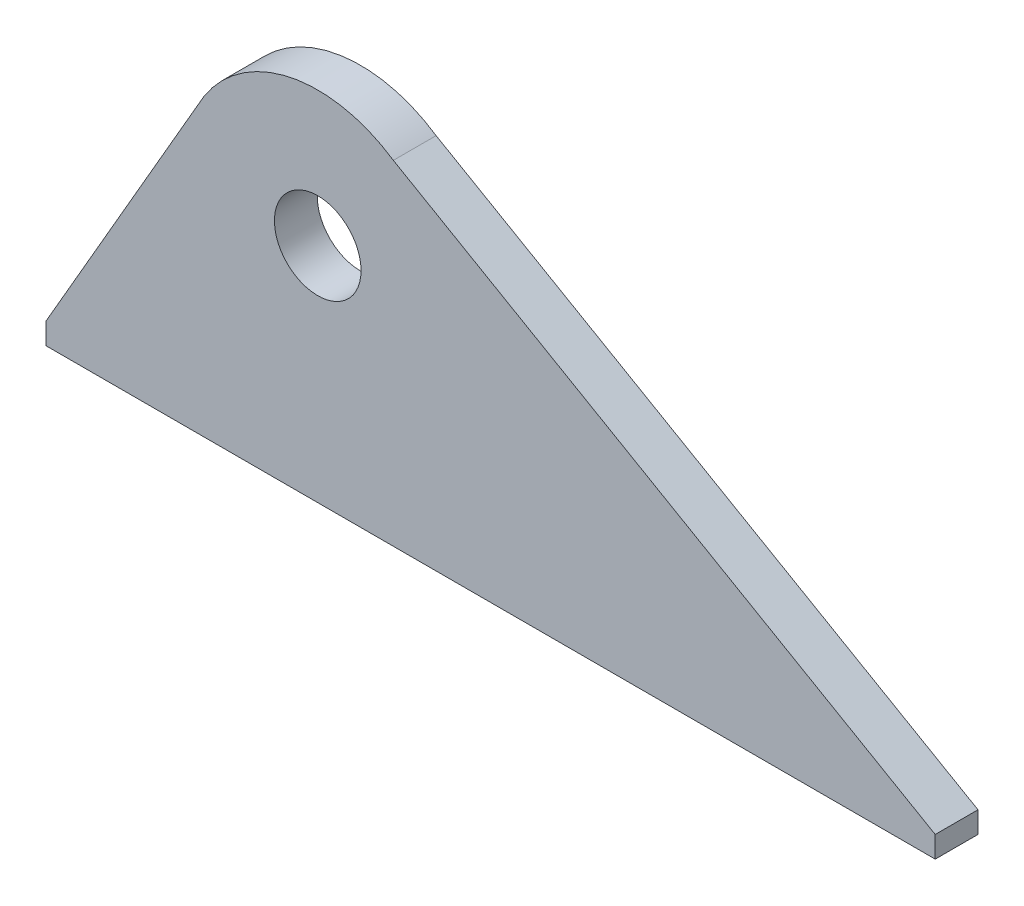
ISO-10303-21;
HEADER;
FILE_DESCRIPTION(('STEP AP214'),'2;1');
FILE_NAME('part.step','',(''),(''),'','','');
FILE_SCHEMA(('AUTOMOTIVE_DESIGN { 1 0 10303 214 1 1 1 1 }'));
ENDSEC;
DATA;
#1=APPLICATION_CONTEXT('core data for automotive mechanical design processes');
#2=APPLICATION_PROTOCOL_DEFINITION('international standard','automotive_design',2000,#1);
#3=PRODUCT_CONTEXT('',#1,'mechanical');
#4=PRODUCT('Part','Part','',(#3));
#5=PRODUCT_RELATED_PRODUCT_CATEGORY('part','',(#4));
#6=PRODUCT_DEFINITION_FORMATION('','',#4);
#7=PRODUCT_DEFINITION_CONTEXT('part definition',#1,'design');
#8=PRODUCT_DEFINITION('design','',#6,#7);
#9=PRODUCT_DEFINITION_SHAPE('','',#8);
#10=(LENGTH_UNIT() NAMED_UNIT(*) SI_UNIT(.MILLI.,.METRE.));
#11=(NAMED_UNIT(*) PLANE_ANGLE_UNIT() SI_UNIT($,.RADIAN.));
#12=(NAMED_UNIT(*) SI_UNIT($,.STERADIAN.) SOLID_ANGLE_UNIT());
#13=UNCERTAINTY_MEASURE_WITH_UNIT(LENGTH_MEASURE(1.E-05),#10,'distance_accuracy_value','');
#14=(GEOMETRIC_REPRESENTATION_CONTEXT(3) GLOBAL_UNCERTAINTY_ASSIGNED_CONTEXT((#13)) GLOBAL_UNIT_ASSIGNED_CONTEXT((#10,
#11,#12)) REPRESENTATION_CONTEXT('',''));
#15=CARTESIAN_POINT('',(0.,0.,0.));
#16=DIRECTION('',(0.,0.,1.));
#17=DIRECTION('',(1.,0.,0.));
#18=AXIS2_PLACEMENT_3D('',#15,#16,#17);
#19=CARTESIAN_POINT('',(63.5247751785543,52.0281381486472,10.));
#20=DIRECTION('',(0.,0.,-1.));
#21=DIRECTION('',(-1.,0.,0.));
#22=AXIS2_PLACEMENT_3D('',#19,#20,#21);
#23=PLANE('',#22);
#24=DIRECTION('',(0.,-1.,0.));
#25=VECTOR('',#24,1.);
#26=CARTESIAN_POINT('',(0.,5.,10.));
#27=LINE('',#26,#25);
#28=CARTESIAN_POINT('',(0.,5.,10.));
#29=VERTEX_POINT('',#28);
#30=CARTESIAN_POINT('',(0.,0.,10.));
#31=VERTEX_POINT('',#30);
#32=EDGE_CURVE('E129',#29,#31,#27,.T.);
#33=ORIENTED_EDGE('',*,*,#32,.T.);
#34=DIRECTION('',(1.,0.,0.));
#35=VECTOR('',#34,1.);
#36=CARTESIAN_POINT('',(0.,0.,10.));
#37=LINE('',#36,#35);
#38=CARTESIAN_POINT('',(207.878588043657,0.,10.));
#39=VERTEX_POINT('',#38);
#40=EDGE_CURVE('E87',#31,#39,#37,.T.);
#41=ORIENTED_EDGE('',*,*,#40,.T.);
#42=DIRECTION('',(0.,1.,0.));
#43=VECTOR('',#42,1.);
#44=CARTESIAN_POINT('',(207.878588043657,0.,10.));
#45=LINE('',#44,#43);
#46=CARTESIAN_POINT('',(207.878588043657,5.,10.));
#47=VERTEX_POINT('',#46);
#48=EDGE_CURVE('E100',#39,#47,#45,.T.);
#49=ORIENTED_EDGE('',*,*,#48,.T.);
#50=DIRECTION('',(-0.866025403784442,0.499999999999995,0.));
#51=VECTOR('',#50,1.);
#52=CARTESIAN_POINT('',(207.878588043657,5.,10.));
#53=LINE('',#52,#51);
#54=CARTESIAN_POINT('',(81.2013031704552,78.1371645217532,10.));
#55=VERTEX_POINT('',#54);
#56=EDGE_CURVE('E94',#47,#55,#53,.T.);
#57=ORIENTED_EDGE('',*,*,#56,.T.);
#58=CARTESIAN_POINT('',(63.5247751785543,52.0281381486472,10.));
#59=DIRECTION('',(0.,0.,1.));
#60=DIRECTION('',(-1.,0.,0.));
#61=AXIS2_PLACEMENT_3D('',#58,#59,#60);
#62=CIRCLE('',#61,31.53);
#63=CARTESIAN_POINT('',(36.9325249575264,68.9690096782423,10.));
#64=VERTEX_POINT('',#63);
#65=EDGE_CURVE('E98',#55,#64,#62,.T.);
#66=ORIENTED_EDGE('',*,*,#65,.T.);
#67=DIRECTION('',(-0.499999999999995,-0.866025403784442,0.));
#68=VECTOR('',#67,1.);
#69=CARTESIAN_POINT('',(36.9325249575264,68.9690096782423,10.));
#70=LINE('',#69,#68);
#71=EDGE_CURVE('E50',#64,#29,#70,.T.);
#72=ORIENTED_EDGE('',*,*,#71,.T.);
#73=EDGE_LOOP('',(#33,#41,#49,#57,#66,#72));
#74=FACE_BOUND('',#73,.T.);
#75=CARTESIAN_POINT('',(63.5247751785543,52.0281381486472,10.));
#76=DIRECTION('',(0.,0.,1.));
#77=DIRECTION('',(1.,0.,0.));
#78=AXIS2_PLACEMENT_3D('',#75,#76,#77);
#79=CIRCLE('',#78,10.1249999999998);
#80=CARTESIAN_POINT('',(73.6497751785541,52.0281381486472,10.));
#81=VERTEX_POINT('',#80);
#82=EDGE_CURVE('E122',#81,#81,#79,.T.);
#83=ORIENTED_EDGE('',*,*,#82,.F.);
#84=EDGE_LOOP('',(#83));
#85=FACE_BOUND('',#84,.T.);
#86=ADVANCED_FACE('F33',(#74,#85),#23,.F.);
#87=CARTESIAN_POINT('',(63.5247751785543,52.0281381486472,0.));
#88=DIRECTION('',(0.,0.,-1.));
#89=DIRECTION('',(-1.,0.,0.));
#90=AXIS2_PLACEMENT_3D('',#87,#88,#89);
#91=PLANE('',#90);
#92=DIRECTION('',(0.,-1.,0.));
#93=VECTOR('',#92,1.);
#94=CARTESIAN_POINT('',(0.,5.,0.));
#95=LINE('',#94,#93);
#96=CARTESIAN_POINT('',(0.,5.,0.));
#97=VERTEX_POINT('',#96);
#98=CARTESIAN_POINT('',(0.,0.,0.));
#99=VERTEX_POINT('',#98);
#100=EDGE_CURVE('E118',#97,#99,#95,.T.);
#101=ORIENTED_EDGE('',*,*,#100,.F.);
#102=DIRECTION('',(-0.499999999999995,-0.866025403784442,0.));
#103=VECTOR('',#102,1.);
#104=CARTESIAN_POINT('',(36.9325249575264,68.9690096782423,0.));
#105=LINE('',#104,#103);
#106=CARTESIAN_POINT('',(36.9325249575264,68.9690096782423,0.));
#107=VERTEX_POINT('',#106);
#108=EDGE_CURVE('E79',#107,#97,#105,.T.);
#109=ORIENTED_EDGE('',*,*,#108,.F.);
#110=CARTESIAN_POINT('',(63.5247751785543,52.0281381486472,0.));
#111=DIRECTION('',(0.,0.,1.));
#112=DIRECTION('',(-1.,0.,0.));
#113=AXIS2_PLACEMENT_3D('',#110,#111,#112);
#114=CIRCLE('',#113,31.53);
#115=CARTESIAN_POINT('',(81.2013031704552,78.1371645217532,0.));
#116=VERTEX_POINT('',#115);
#117=EDGE_CURVE('E73',#116,#107,#114,.T.);
#118=ORIENTED_EDGE('',*,*,#117,.F.);
#119=DIRECTION('',(-0.866025403784442,0.499999999999995,0.));
#120=VECTOR('',#119,1.);
#121=CARTESIAN_POINT('',(207.878588043657,5.,0.));
#122=LINE('',#121,#120);
#123=CARTESIAN_POINT('',(207.878588043657,5.,0.));
#124=VERTEX_POINT('',#123);
#125=EDGE_CURVE('E108',#124,#116,#122,.T.);
#126=ORIENTED_EDGE('',*,*,#125,.F.);
#127=DIRECTION('',(0.,1.,0.));
#128=VECTOR('',#127,1.);
#129=CARTESIAN_POINT('',(207.878588043657,0.,0.));
#130=LINE('',#129,#128);
#131=CARTESIAN_POINT('',(207.878588043657,0.,0.));
#132=VERTEX_POINT('',#131);
#133=EDGE_CURVE('E124',#132,#124,#130,.T.);
#134=ORIENTED_EDGE('',*,*,#133,.F.);
#135=DIRECTION('',(1.,0.,0.));
#136=VECTOR('',#135,1.);
#137=CARTESIAN_POINT('',(0.,0.,0.));
#138=LINE('',#137,#136);
#139=EDGE_CURVE('E121',#99,#132,#138,.T.);
#140=ORIENTED_EDGE('',*,*,#139,.F.);
#141=EDGE_LOOP('',(#101,#109,#118,#126,#134,#140));
#142=FACE_BOUND('',#141,.T.);
#143=CARTESIAN_POINT('',(63.5247751785543,52.0281381486472,0.));
#144=DIRECTION('',(0.,0.,1.));
#145=DIRECTION('',(1.,0.,0.));
#146=AXIS2_PLACEMENT_3D('',#143,#144,#145);
#147=CIRCLE('',#146,10.1249999999998);
#148=CARTESIAN_POINT('',(73.6497751785541,52.0281381486472,0.));
#149=VERTEX_POINT('',#148);
#150=EDGE_CURVE('E222',#149,#149,#147,.T.);
#151=ORIENTED_EDGE('',*,*,#150,.T.);
#152=EDGE_LOOP('',(#151));
#153=FACE_BOUND('',#152,.T.);
#154=ADVANCED_FACE('F138',(#142,#153),#91,.T.);
#155=CARTESIAN_POINT('',(0.,5.,10.));
#156=DIRECTION('',(1.,0.,0.));
#157=DIRECTION('',(0.,0.,-1.));
#158=AXIS2_PLACEMENT_3D('',#155,#156,#157);
#159=PLANE('',#158);
#160=ORIENTED_EDGE('',*,*,#100,.T.);
#161=DIRECTION('',(0.,0.,-1.));
#162=VECTOR('',#161,1.);
#163=CARTESIAN_POINT('',(0.,0.,10.));
#164=LINE('',#163,#162);
#165=EDGE_CURVE('E11',#31,#99,#164,.T.);
#166=ORIENTED_EDGE('',*,*,#165,.F.);
#167=ORIENTED_EDGE('',*,*,#32,.F.);
#168=DIRECTION('',(0.,0.,-1.));
#169=VECTOR('',#168,1.);
#170=CARTESIAN_POINT('',(0.,5.,10.));
#171=LINE('',#170,#169);
#172=EDGE_CURVE('E114',#29,#97,#171,.T.);
#173=ORIENTED_EDGE('',*,*,#172,.T.);
#174=EDGE_LOOP('',(#160,#166,#167,#173));
#175=FACE_BOUND('',#174,.T.);
#176=ADVANCED_FACE('F35',(#175),#159,.F.);
#177=CARTESIAN_POINT('',(0.,0.,10.));
#178=DIRECTION('',(0.,1.,0.));
#179=DIRECTION('',(0.,0.,1.));
#180=AXIS2_PLACEMENT_3D('',#177,#178,#179);
#181=PLANE('',#180);
#182=ORIENTED_EDGE('',*,*,#139,.T.);
#183=DIRECTION('',(0.,0.,-1.));
#184=VECTOR('',#183,1.);
#185=CARTESIAN_POINT('',(207.878588043657,0.,10.));
#186=LINE('',#185,#184);
#187=EDGE_CURVE('E42',#39,#132,#186,.T.);
#188=ORIENTED_EDGE('',*,*,#187,.F.);
#189=ORIENTED_EDGE('',*,*,#40,.F.);
#190=ORIENTED_EDGE('',*,*,#165,.T.);
#191=EDGE_LOOP('',(#182,#188,#189,#190));
#192=FACE_BOUND('',#191,.T.);
#193=ADVANCED_FACE('F163',(#192),#181,.F.);
#194=CARTESIAN_POINT('',(207.878588043657,0.,10.));
#195=DIRECTION('',(-1.,0.,0.));
#196=DIRECTION('',(0.,0.,1.));
#197=AXIS2_PLACEMENT_3D('',#194,#195,#196);
#198=PLANE('',#197);
#199=ORIENTED_EDGE('',*,*,#133,.T.);
#200=DIRECTION('',(0.,0.,-1.));
#201=VECTOR('',#200,1.);
#202=CARTESIAN_POINT('',(207.878588043657,5.,10.));
#203=LINE('',#202,#201);
#204=EDGE_CURVE('E109',#47,#124,#203,.T.);
#205=ORIENTED_EDGE('',*,*,#204,.F.);
#206=ORIENTED_EDGE('',*,*,#48,.F.);
#207=ORIENTED_EDGE('',*,*,#187,.T.);
#208=EDGE_LOOP('',(#199,#205,#206,#207));
#209=FACE_BOUND('',#208,.T.);
#210=ADVANCED_FACE('F135',(#209),#198,.F.);
#211=CARTESIAN_POINT('',(207.878588043657,5.,10.));
#212=DIRECTION('',(-0.499999999999995,-0.866025403784442,0.));
#213=DIRECTION('',(0.866025403784442,-0.499999999999995,0.));
#214=AXIS2_PLACEMENT_3D('',#211,#212,#213);
#215=PLANE('',#214);
#216=ORIENTED_EDGE('',*,*,#125,.T.);
#217=DIRECTION('',(0.,0.,-1.));
#218=VECTOR('',#217,1.);
#219=CARTESIAN_POINT('',(81.2013031704552,78.1371645217532,10.));
#220=LINE('',#219,#218);
#221=EDGE_CURVE('E105',#55,#116,#220,.T.);
#222=ORIENTED_EDGE('',*,*,#221,.F.);
#223=ORIENTED_EDGE('',*,*,#56,.F.);
#224=ORIENTED_EDGE('',*,*,#204,.T.);
#225=EDGE_LOOP('',(#216,#222,#223,#224));
#226=FACE_BOUND('',#225,.T.);
#227=ADVANCED_FACE('F106',(#226),#215,.F.);
#228=CARTESIAN_POINT('',(63.5247751785543,52.0281381486472,10.));
#229=DIRECTION('',(0.,0.,-1.));
#230=DIRECTION('',(-1.,0.,0.));
#231=AXIS2_PLACEMENT_3D('',#228,#229,#230);
#232=CYLINDRICAL_SURFACE('',#231,31.53);
#233=ORIENTED_EDGE('',*,*,#117,.T.);
#234=DIRECTION('',(0.,0.,-1.));
#235=VECTOR('',#234,1.);
#236=CARTESIAN_POINT('',(36.9325249575264,68.9690096782423,10.));
#237=LINE('',#236,#235);
#238=EDGE_CURVE('E110',#64,#107,#237,.T.);
#239=ORIENTED_EDGE('',*,*,#238,.F.);
#240=ORIENTED_EDGE('',*,*,#65,.F.);
#241=ORIENTED_EDGE('',*,*,#221,.T.);
#242=EDGE_LOOP('',(#233,#239,#240,#241));
#243=FACE_BOUND('',#242,.T.);
#244=ADVANCED_FACE('F112',(#243),#232,.T.);
#245=CARTESIAN_POINT('',(36.9325249575264,68.9690096782423,10.));
#246=DIRECTION('',(0.866025403784442,-0.499999999999995,0.));
#247=DIRECTION('',(0.499999999999995,0.866025403784442,0.));
#248=AXIS2_PLACEMENT_3D('',#245,#246,#247);
#249=PLANE('',#248);
#250=ORIENTED_EDGE('',*,*,#108,.T.);
#251=ORIENTED_EDGE('',*,*,#172,.F.);
#252=ORIENTED_EDGE('',*,*,#71,.F.);
#253=ORIENTED_EDGE('',*,*,#238,.T.);
#254=EDGE_LOOP('',(#250,#251,#252,#253));
#255=FACE_BOUND('',#254,.T.);
#256=ADVANCED_FACE('F143',(#255),#249,.F.);
#257=CARTESIAN_POINT('',(63.5247751785543,52.0281381486472,10.));
#258=DIRECTION('',(0.,0.,-1.));
#259=DIRECTION('',(-1.,0.,0.));
#260=AXIS2_PLACEMENT_3D('',#257,#258,#259);
#261=CYLINDRICAL_SURFACE('',#260,10.1249999999998);
#262=ORIENTED_EDGE('',*,*,#82,.T.);
#263=EDGE_LOOP('',(#262));
#264=FACE_BOUND('',#263,.T.);
#265=ORIENTED_EDGE('',*,*,#150,.F.);
#266=EDGE_LOOP('',(#265));
#267=FACE_BOUND('',#266,.T.);
#268=ADVANCED_FACE('F145',(#264,#267),#261,.F.);
#269=CLOSED_SHELL('',(#86,#154,#176,#193,#210,#227,#244,#256,#268));
#270=MANIFOLD_SOLID_BREP('B2',#269);
#271=ADVANCED_BREP_SHAPE_REPRESENTATION('',(#18,#270),#14);
#272=SHAPE_DEFINITION_REPRESENTATION(#9,#271);
ENDSEC;
END-ISO-10303-21;
